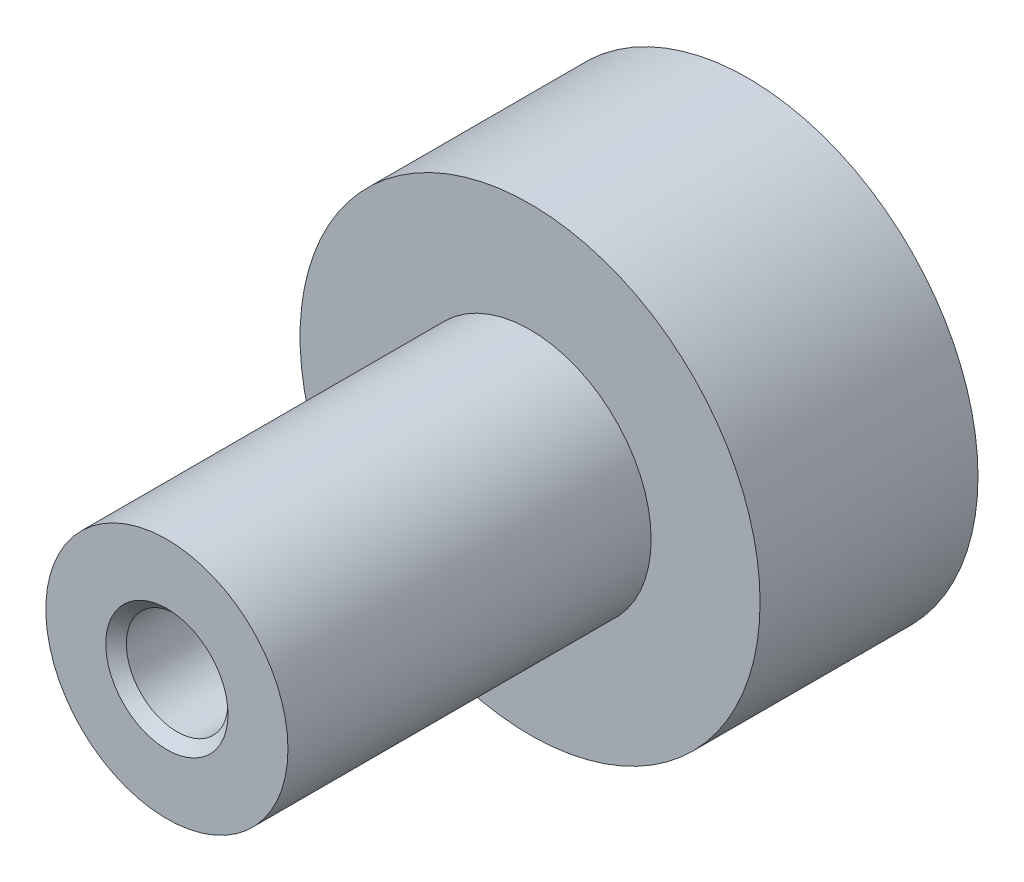
ISO-10303-21;
HEADER;
FILE_DESCRIPTION(('STEP AP214'),'2;1');
FILE_NAME('part.step','',(''),(''),'','','');
FILE_SCHEMA(('AUTOMOTIVE_DESIGN { 1 0 10303 214 1 1 1 1 }'));
ENDSEC;
DATA;
#1=APPLICATION_CONTEXT('core data for automotive mechanical design processes');
#2=APPLICATION_PROTOCOL_DEFINITION('international standard','automotive_design',2000,#1);
#3=PRODUCT_CONTEXT('',#1,'mechanical');
#4=PRODUCT('Part','Part','',(#3));
#5=PRODUCT_RELATED_PRODUCT_CATEGORY('part','',(#4));
#6=PRODUCT_DEFINITION_FORMATION('','',#4);
#7=PRODUCT_DEFINITION_CONTEXT('part definition',#1,'design');
#8=PRODUCT_DEFINITION('design','',#6,#7);
#9=PRODUCT_DEFINITION_SHAPE('','',#8);
#10=(LENGTH_UNIT() NAMED_UNIT(*) SI_UNIT(.MILLI.,.METRE.));
#11=(NAMED_UNIT(*) PLANE_ANGLE_UNIT() SI_UNIT($,.RADIAN.));
#12=(NAMED_UNIT(*) SI_UNIT($,.STERADIAN.) SOLID_ANGLE_UNIT());
#13=UNCERTAINTY_MEASURE_WITH_UNIT(LENGTH_MEASURE(1.E-05),#10,'distance_accuracy_value','');
#14=(GEOMETRIC_REPRESENTATION_CONTEXT(3) GLOBAL_UNCERTAINTY_ASSIGNED_CONTEXT((#13)) GLOBAL_UNIT_ASSIGNED_CONTEXT((#10,
#11,#12)) REPRESENTATION_CONTEXT('',''));
#15=CARTESIAN_POINT('',(0.,0.,0.));
#16=DIRECTION('',(0.,0.,1.));
#17=DIRECTION('',(1.,0.,0.));
#18=AXIS2_PLACEMENT_3D('',#15,#16,#17);
#19=CARTESIAN_POINT('',(0.,0.,6.));
#20=DIRECTION('',(0.,0.,-1.));
#21=DIRECTION('',(-1.,0.,0.));
#22=AXIS2_PLACEMENT_3D('',#19,#20,#21);
#23=CYLINDRICAL_SURFACE('',#22,8.);
#24=DIRECTION('',(0.,0.,-1.));
#25=VECTOR('',#24,1.);
#26=CARTESIAN_POINT('',(-7.46864341197762,2.86694359636239,15.0057826848429));
#27=LINE('',#26,#25);
#28=CARTESIAN_POINT('',(-7.46864341197762,2.86694359636239,6.));
#29=VERTEX_POINT('',#28);
#30=CARTESIAN_POINT('',(-7.46864341197762,2.86694359636239,0.));
#31=VERTEX_POINT('',#30);
#32=EDGE_CURVE('E207',#29,#31,#27,.T.);
#33=ORIENTED_EDGE('',*,*,#32,.T.);
#34=CARTESIAN_POINT('',(0.,0.,0.));
#35=DIRECTION('',(0.,0.,1.));
#36=DIRECTION('',(1.,0.,0.));
#37=AXIS2_PLACEMENT_3D('',#34,#35,#36);
#38=CIRCLE('',#37,8.);
#39=CARTESIAN_POINT('',(-6.7093645435634,4.3571122801202,0.));
#40=VERTEX_POINT('',#39);
#41=EDGE_CURVE('E330',#40,#31,#38,.T.);
#42=ORIENTED_EDGE('',*,*,#41,.F.);
#43=DIRECTION('',(0.,0.,-1.));
#44=VECTOR('',#43,1.);
#45=CARTESIAN_POINT('',(-6.7093645435634,4.3571122801202,14.9487354809935));
#46=LINE('',#45,#44);
#47=CARTESIAN_POINT('',(-6.7093645435634,4.3571122801202,6.));
#48=VERTEX_POINT('',#47);
#49=EDGE_CURVE('E282',#48,#40,#46,.T.);
#50=ORIENTED_EDGE('',*,*,#49,.F.);
#51=CARTESIAN_POINT('',(0.,0.,6.));
#52=DIRECTION('',(0.,0.,1.));
#53=DIRECTION('',(1.,0.,0.));
#54=AXIS2_PLACEMENT_3D('',#51,#52,#53);
#55=CIRCLE('',#54,8.);
#56=EDGE_CURVE('E328',#48,#29,#55,.T.);
#57=ORIENTED_EDGE('',*,*,#56,.T.);
#58=EDGE_LOOP('',(#33,#42,#50,#57));
#59=FACE_BOUND('',#58,.T.);
#60=ADVANCED_FACE('F36',(#59),#23,.F.);
#61=DIRECTION('',(0.,0.,-1.));
#62=VECTOR('',#61,1.);
#63=CARTESIAN_POINT('',(-6.21716769165574,-5.03456312839873,15.0057826848429));
#64=LINE('',#63,#62);
#65=CARTESIAN_POINT('',(-6.21716769165574,-5.03456312839873,6.));
#66=VERTEX_POINT('',#65);
#67=CARTESIAN_POINT('',(-6.21716769165574,-5.03456312839873,0.));
#68=VERTEX_POINT('',#67);
#69=EDGE_CURVE('E216',#66,#68,#64,.T.);
#70=ORIENTED_EDGE('',*,*,#69,.F.);
#71=CARTESIAN_POINT('',(-5.03456312839867,-6.21716769165579,6.));
#72=VERTEX_POINT('',#71);
#73=EDGE_CURVE('E357',#66,#72,#55,.T.);
#74=ORIENTED_EDGE('',*,*,#73,.T.);
#75=DIRECTION('',(0.,0.,-1.));
#76=VECTOR('',#75,1.);
#77=CARTESIAN_POINT('',(-5.03456312839867,-6.21716769165579,15.0057826848429));
#78=LINE('',#77,#76);
#79=CARTESIAN_POINT('',(-5.03456312839867,-6.21716769165579,0.));
#80=VERTEX_POINT('',#79);
#81=EDGE_CURVE('E233',#72,#80,#78,.T.);
#82=ORIENTED_EDGE('',*,*,#81,.T.);
#83=EDGE_CURVE('E336',#68,#80,#38,.T.);
#84=ORIENTED_EDGE('',*,*,#83,.F.);
#85=EDGE_LOOP('',(#70,#74,#82,#84));
#86=FACE_BOUND('',#85,.T.);
#87=ADVANCED_FACE('F355',(#86),#23,.F.);
#88=DIRECTION('',(0.,0.,-1.));
#89=VECTOR('',#88,1.);
#90=CARTESIAN_POINT('',(2.86694359636246,-7.46864341197759,15.0057826848429));
#91=LINE('',#90,#89);
#92=CARTESIAN_POINT('',(2.86694359636246,-7.46864341197759,6.));
#93=VERTEX_POINT('',#92);
#94=CARTESIAN_POINT('',(2.86694359636246,-7.46864341197759,0.));
#95=VERTEX_POINT('',#94);
#96=EDGE_CURVE('E240',#93,#95,#91,.T.);
#97=ORIENTED_EDGE('',*,*,#96,.F.);
#98=CARTESIAN_POINT('',(4.35711228012027,-6.70936454356336,6.));
#99=VERTEX_POINT('',#98);
#100=EDGE_CURVE('E369',#93,#99,#55,.T.);
#101=ORIENTED_EDGE('',*,*,#100,.T.);
#102=DIRECTION('',(0.,0.,-1.));
#103=VECTOR('',#102,1.);
#104=CARTESIAN_POINT('',(4.35711228012027,-6.70936454356336,14.9487354809935));
#105=LINE('',#104,#103);
#106=CARTESIAN_POINT('',(4.35711228012027,-6.70936454356336,0.));
#107=VERTEX_POINT('',#106);
#108=EDGE_CURVE('E251',#99,#107,#105,.T.);
#109=ORIENTED_EDGE('',*,*,#108,.T.);
#110=EDGE_CURVE('E337',#95,#107,#38,.T.);
#111=ORIENTED_EDGE('',*,*,#110,.F.);
#112=EDGE_LOOP('',(#97,#101,#109,#111));
#113=FACE_BOUND('',#112,.T.);
#114=ADVANCED_FACE('F367',(#113),#23,.F.);
#115=DIRECTION('',(0.,0.,-1.));
#116=VECTOR('',#115,1.);
#117=CARTESIAN_POINT('',(0.418687649943556,7.98903627803659,14.9487354809935));
#118=LINE('',#117,#116);
#119=CARTESIAN_POINT('',(0.418687649943556,7.98903627803659,6.));
#120=VERTEX_POINT('',#119);
#121=CARTESIAN_POINT('',(0.418687649943556,7.98903627803659,0.));
#122=VERTEX_POINT('',#121);
#123=EDGE_CURVE('E273',#120,#122,#118,.T.);
#124=ORIENTED_EDGE('',*,*,#123,.T.);
#125=CARTESIAN_POINT('',(2.07055236082017,7.72740661031255,0.));
#126=VERTEX_POINT('',#125);
#127=EDGE_CURVE('E44',#126,#122,#38,.T.);
#128=ORIENTED_EDGE('',*,*,#127,.F.);
#129=DIRECTION('',(0.,0.,-1.));
#130=VECTOR('',#129,1.);
#131=CARTESIAN_POINT('',(2.07055236082017,7.72740661031255,15.0245190528384));
#132=LINE('',#131,#130);
#133=CARTESIAN_POINT('',(2.07055236082017,7.72740661031255,6.));
#134=VERTEX_POINT('',#133);
#135=EDGE_CURVE('E309',#134,#126,#132,.T.);
#136=ORIENTED_EDGE('',*,*,#135,.F.);
#137=EDGE_CURVE('E325',#134,#120,#55,.T.);
#138=ORIENTED_EDGE('',*,*,#137,.T.);
#139=EDGE_LOOP('',(#124,#128,#136,#138));
#140=FACE_BOUND('',#139,.T.);
#141=ADVANCED_FACE('F409',(#140),#23,.F.);
#142=CARTESIAN_POINT('',(0.,0.,0.));
#143=DIRECTION('',(0.,0.,1.));
#144=DIRECTION('',(1.,0.,0.));
#145=AXIS2_PLACEMENT_3D('',#142,#143,#144);
#146=PLANE('',#145);
#147=ORIENTED_EDGE('',*,*,#41,.T.);
#148=DIRECTION('',(0.933580426497202,-0.358367949545298,0.));
#149=VECTOR('',#148,1.);
#150=CARTESIAN_POINT('',(-7.46864341197762,2.86694359636239,0.));
#151=LINE('',#150,#149);
#152=CARTESIAN_POINT('',(-8.16882873185052,3.13571955852136,0.));
#153=VERTEX_POINT('',#152);
#154=EDGE_CURVE('E200',#153,#31,#151,.T.);
#155=ORIENTED_EDGE('',*,*,#154,.F.);
#156=CARTESIAN_POINT('',(1.81921811592645E-13,0.,0.));
#157=DIRECTION('',(0.,0.,-1.));
#158=DIRECTION('',(-0.809016994374951,0.587785252292469,0.));
#159=AXIS2_PLACEMENT_3D('',#156,#157,#158);
#160=CIRCLE('',#159,8.75000000000016);
#161=CARTESIAN_POINT('',(-6.80002716274847,-5.50655342168611,0.));
#162=VERTEX_POINT('',#161);
#163=EDGE_CURVE('E202',#162,#153,#160,.T.);
#164=ORIENTED_EDGE('',*,*,#163,.F.);
#165=DIRECTION('',(-0.777145961456967,-0.629320391049841,0.));
#166=VECTOR('',#165,1.);
#167=CARTESIAN_POINT('',(-6.21716769165574,-5.03456312839873,0.));
#168=LINE('',#167,#166);
#169=EDGE_CURVE('E196',#68,#162,#168,.T.);
#170=ORIENTED_EDGE('',*,*,#169,.F.);
#171=ORIENTED_EDGE('',*,*,#83,.T.);
#172=DIRECTION('',(0.629320391049833,0.777145961456974,0.));
#173=VECTOR('',#172,1.);
#174=CARTESIAN_POINT('',(-5.03456312839867,-6.21716769165579,0.));
#175=LINE('',#174,#173);
#176=CARTESIAN_POINT('',(-5.50655342168604,-6.80002716274853,0.));
#177=VERTEX_POINT('',#176);
#178=EDGE_CURVE('E226',#177,#80,#175,.T.);
#179=ORIENTED_EDGE('',*,*,#178,.F.);
#180=CARTESIAN_POINT('',(0.,1.81538035696024E-13,0.));
#181=DIRECTION('',(0.,0.,-1.));
#182=DIRECTION('',(-0.809016994374942,-0.58778525229248,0.));
#183=AXIS2_PLACEMENT_3D('',#180,#181,#182);
#184=CIRCLE('',#183,8.75000000000016);
#185=CARTESIAN_POINT('',(3.13571955852144,-8.16882873185049,0.));
#186=VERTEX_POINT('',#185);
#187=EDGE_CURVE('E228',#186,#177,#184,.T.);
#188=ORIENTED_EDGE('',*,*,#187,.F.);
#189=DIRECTION('',(0.358367949545308,-0.933580426497199,0.));
#190=VECTOR('',#189,1.);
#191=CARTESIAN_POINT('',(2.86694359636246,-7.46864341197759,0.));
#192=LINE('',#191,#190);
#193=EDGE_CURVE('E223',#95,#186,#192,.T.);
#194=ORIENTED_EDGE('',*,*,#193,.F.);
#195=ORIENTED_EDGE('',*,*,#110,.T.);
#196=DIRECTION('',(-0.544639035015034,0.83867056794542,0.));
#197=VECTOR('',#196,1.);
#198=CARTESIAN_POINT('',(4.35711228012027,-6.70936454356336,0.));
#199=LINE('',#198,#197);
#200=CARTESIAN_POINT('',(4.76559155638155,-7.33836746952242,0.));
#201=VERTEX_POINT('',#200);
#202=EDGE_CURVE('E189',#201,#107,#199,.T.);
#203=ORIENTED_EDGE('',*,*,#202,.F.);
#204=CARTESIAN_POINT('',(-1.63384052015606E-13,0.,0.));
#205=DIRECTION('',(0.,0.,-1.));
#206=DIRECTION('',(0.309016994374958,-0.95105651629515,0.));
#207=AXIS2_PLACEMENT_3D('',#204,#205,#206);
#208=CIRCLE('',#207,8.75000000000016);
#209=CARTESIAN_POINT('',(8.73800842910252,0.457939617125851,0.));
#210=VERTEX_POINT('',#209);
#211=EDGE_CURVE('E185',#210,#201,#208,.T.);
#212=ORIENTED_EDGE('',*,*,#211,.F.);
#213=DIRECTION('',(0.998629534754573,0.0523359562429548,0.));
#214=VECTOR('',#213,1.);
#215=CARTESIAN_POINT('',(7.98903627803659,0.418687649943635,0.));
#216=LINE('',#215,#214);
#217=CARTESIAN_POINT('',(7.98903627803659,0.418687649943635,0.));
#218=VERTEX_POINT('',#217);
#219=EDGE_CURVE('E246',#218,#210,#216,.T.);
#220=ORIENTED_EDGE('',*,*,#219,.F.);
#221=CARTESIAN_POINT('',(7.72740661031255,2.07055236082014,0.));
#222=VERTEX_POINT('',#221);
#223=EDGE_CURVE('E327',#218,#222,#38,.T.);
#224=ORIENTED_EDGE('',*,*,#223,.T.);
#225=DIRECTION('',(-0.965925826289069,-0.258819045102517,0.));
#226=VECTOR('',#225,1.);
#227=CARTESIAN_POINT('',(7.72740661031255,2.07055236082014,0.));
#228=LINE('',#227,#226);
#229=CARTESIAN_POINT('',(8.45185098002936,2.26466664464703,0.));
#230=VERTEX_POINT('',#229);
#231=EDGE_CURVE('E293',#230,#222,#228,.T.);
#232=ORIENTED_EDGE('',*,*,#231,.F.);
#233=CARTESIAN_POINT('',(-1.30971622436249E-13,-1.29236898960272E-13,0.));
#234=DIRECTION('',(0.,0.,-1.));
#235=DIRECTION('',(1.,0.,0.));
#236=AXIS2_PLACEMENT_3D('',#233,#234,#235);
#237=CIRCLE('',#236,8.75000000000016);
#238=CARTESIAN_POINT('',(2.26466664464706,8.45185098002935,0.));
#239=VERTEX_POINT('',#238);
#240=EDGE_CURVE('E288',#239,#230,#237,.T.);
#241=ORIENTED_EDGE('',*,*,#240,.F.);
#242=DIRECTION('',(0.258819045102521,0.965925826289068,0.));
#243=VECTOR('',#242,1.);
#244=CARTESIAN_POINT('',(2.07055236082017,7.72740661031255,0.));
#245=LINE('',#244,#243);
#246=EDGE_CURVE('E289',#126,#239,#245,.T.);
#247=ORIENTED_EDGE('',*,*,#246,.F.);
#248=ORIENTED_EDGE('',*,*,#127,.T.);
#249=DIRECTION('',(-0.0523359562429445,-0.998629534754574,0.));
#250=VECTOR('',#249,1.);
#251=CARTESIAN_POINT('',(0.418687649943556,7.98903627803659,0.));
#252=LINE('',#251,#250);
#253=CARTESIAN_POINT('',(0.457939617125764,8.73800842910252,0.));
#254=VERTEX_POINT('',#253);
#255=EDGE_CURVE('E268',#254,#122,#252,.T.);
#256=ORIENTED_EDGE('',*,*,#255,.F.);
#257=CARTESIAN_POINT('',(0.,-1.64497813046785E-13,0.));
#258=DIRECTION('',(0.,0.,-1.));
#259=DIRECTION('',(0.309016994374945,0.951056516295155,0.));
#260=AXIS2_PLACEMENT_3D('',#257,#258,#259);
#261=CIRCLE('',#260,8.75000000000016);
#262=CARTESIAN_POINT('',(-7.33836746952247,4.76559155638147,0.));
#263=VERTEX_POINT('',#262);
#264=EDGE_CURVE('E222',#263,#254,#261,.T.);
#265=ORIENTED_EDGE('',*,*,#264,.F.);
#266=DIRECTION('',(-0.838670567945425,0.544639035015025,0.));
#267=VECTOR('',#266,1.);
#268=CARTESIAN_POINT('',(-6.7093645435634,4.3571122801202,0.));
#269=LINE('',#268,#267);
#270=EDGE_CURVE('E264',#40,#263,#269,.T.);
#271=ORIENTED_EDGE('',*,*,#270,.F.);
#272=EDGE_LOOP('',(#147,#155,#164,#170,#171,#179,#188,#194,#195,#203,#212,#220,#224,#232,#241,
#247,#248,#256,#265,#271));
#273=FACE_BOUND('',#272,.T.);
#274=CARTESIAN_POINT('',(0.,0.,0.));
#275=DIRECTION('',(0.,0.,1.));
#276=DIRECTION('',(1.,0.,0.));
#277=AXIS2_PLACEMENT_3D('',#274,#275,#276);
#278=CIRCLE('',#277,9.5);
#279=CARTESIAN_POINT('',(9.5,0.,0.));
#280=VERTEX_POINT('',#279);
#281=EDGE_CURVE('E11',#280,#280,#278,.T.);
#282=ORIENTED_EDGE('',*,*,#281,.F.);
#283=EDGE_LOOP('',(#282));
#284=FACE_BOUND('',#283,.T.);
#285=ADVANCED_FACE('F349',(#273,#284),#146,.F.);
#286=CARTESIAN_POINT('',(0.,0.,6.));
#287=DIRECTION('',(0.,0.,-1.));
#288=DIRECTION('',(-1.,0.,0.));
#289=AXIS2_PLACEMENT_3D('',#286,#287,#288);
#290=CYLINDRICAL_SURFACE('',#289,9.5);
#291=ORIENTED_EDGE('',*,*,#281,.T.);
#292=EDGE_LOOP('',(#291));
#293=FACE_BOUND('',#292,.T.);
#294=CARTESIAN_POINT('',(0.,0.,9.));
#295=DIRECTION('',(0.,0.,1.));
#296=DIRECTION('',(1.,0.,0.));
#297=AXIS2_PLACEMENT_3D('',#294,#295,#296);
#298=CIRCLE('',#297,9.5);
#299=CARTESIAN_POINT('',(9.5,0.,9.));
#300=VERTEX_POINT('',#299);
#301=EDGE_CURVE('E319',#300,#300,#298,.T.);
#302=ORIENTED_EDGE('',*,*,#301,.F.);
#303=EDGE_LOOP('',(#302));
#304=FACE_BOUND('',#303,.T.);
#305=ADVANCED_FACE('F38',(#293,#304),#290,.T.);
#306=DIRECTION('',(0.,0.,-1.));
#307=VECTOR('',#306,1.);
#308=CARTESIAN_POINT('',(7.98903627803659,0.418687649943635,14.9487354809935));
#309=LINE('',#308,#307);
#310=CARTESIAN_POINT('',(7.98903627803659,0.418687649943634,6.));
#311=VERTEX_POINT('',#310);
#312=EDGE_CURVE('E258',#311,#218,#309,.T.);
#313=ORIENTED_EDGE('',*,*,#312,.F.);
#314=CARTESIAN_POINT('',(7.72740661031255,2.07055236082014,6.));
#315=VERTEX_POINT('',#314);
#316=EDGE_CURVE('E324',#311,#315,#55,.T.);
#317=ORIENTED_EDGE('',*,*,#316,.T.);
#318=DIRECTION('',(0.,0.,-1.));
#319=VECTOR('',#318,1.);
#320=CARTESIAN_POINT('',(7.72740661031255,2.07055236082014,15.0245190528384));
#321=LINE('',#320,#319);
#322=EDGE_CURVE('E300',#315,#222,#321,.T.);
#323=ORIENTED_EDGE('',*,*,#322,.T.);
#324=ORIENTED_EDGE('',*,*,#223,.F.);
#325=EDGE_LOOP('',(#313,#317,#323,#324));
#326=FACE_BOUND('',#325,.T.);
#327=ADVANCED_FACE('F382',(#326),#23,.F.);
#328=CARTESIAN_POINT('',(0.,0.,6.));
#329=DIRECTION('',(0.,0.,1.));
#330=DIRECTION('',(1.,0.,0.));
#331=AXIS2_PLACEMENT_3D('',#328,#329,#330);
#332=PLANE('',#331);
#333=ORIENTED_EDGE('',*,*,#137,.F.);
#334=DIRECTION('',(0.258819045102521,0.965925826289068,0.));
#335=VECTOR('',#334,1.);
#336=CARTESIAN_POINT('',(2.07055236082017,7.72740661031255,6.));
#337=LINE('',#336,#335);
#338=CARTESIAN_POINT('',(2.26466664464706,8.45185098002935,6.));
#339=VERTEX_POINT('',#338);
#340=EDGE_CURVE('E306',#134,#339,#337,.T.);
#341=ORIENTED_EDGE('',*,*,#340,.T.);
#342=CARTESIAN_POINT('',(-1.30971622436249E-13,-1.29236898960272E-13,6.));
#343=DIRECTION('',(0.,0.,1.));
#344=DIRECTION('',(1.,0.,0.));
#345=AXIS2_PLACEMENT_3D('',#342,#343,#344);
#346=CIRCLE('',#345,8.75000000000016);
#347=CARTESIAN_POINT('',(8.45185098002936,2.26466664464703,6.));
#348=VERTEX_POINT('',#347);
#349=EDGE_CURVE('E301',#339,#348,#346,.F.);
#350=ORIENTED_EDGE('',*,*,#349,.T.);
#351=DIRECTION('',(-0.965925826289069,-0.258819045102517,0.));
#352=VECTOR('',#351,1.);
#353=CARTESIAN_POINT('',(7.72740661031255,2.07055236082014,6.));
#354=LINE('',#353,#352);
#355=EDGE_CURVE('E292',#348,#315,#354,.T.);
#356=ORIENTED_EDGE('',*,*,#355,.T.);
#357=ORIENTED_EDGE('',*,*,#316,.F.);
#358=DIRECTION('',(0.998629534754574,0.0523359562429548,0.));
#359=VECTOR('',#358,1.);
#360=CARTESIAN_POINT('',(7.98903627803659,0.418687649943635,6.));
#361=LINE('',#360,#359);
#362=CARTESIAN_POINT('',(8.73800842910252,0.457939617125851,6.));
#363=VERTEX_POINT('',#362);
#364=EDGE_CURVE('E255',#311,#363,#361,.T.);
#365=ORIENTED_EDGE('',*,*,#364,.T.);
#366=CARTESIAN_POINT('',(-1.63384052015606E-13,0.,6.));
#367=DIRECTION('',(0.,0.,1.));
#368=DIRECTION('',(1.,0.,0.));
#369=AXIS2_PLACEMENT_3D('',#366,#367,#368);
#370=CIRCLE('',#369,8.75000000000016);
#371=CARTESIAN_POINT('',(4.76559155638154,-7.33836746952242,6.));
#372=VERTEX_POINT('',#371);
#373=EDGE_CURVE('E252',#363,#372,#370,.F.);
#374=ORIENTED_EDGE('',*,*,#373,.T.);
#375=DIRECTION('',(-0.544639035015034,0.83867056794542,0.));
#376=VECTOR('',#375,1.);
#377=CARTESIAN_POINT('',(4.35711228012027,-6.70936454356336,6.));
#378=LINE('',#377,#376);
#379=EDGE_CURVE('E51',#372,#99,#378,.T.);
#380=ORIENTED_EDGE('',*,*,#379,.T.);
#381=ORIENTED_EDGE('',*,*,#100,.F.);
#382=DIRECTION('',(0.358367949545308,-0.933580426497199,0.));
#383=VECTOR('',#382,1.);
#384=CARTESIAN_POINT('',(2.86694359636246,-7.46864341197759,6.));
#385=LINE('',#384,#383);
#386=CARTESIAN_POINT('',(3.13571955852144,-8.16882873185049,6.));
#387=VERTEX_POINT('',#386);
#388=EDGE_CURVE('E237',#93,#387,#385,.T.);
#389=ORIENTED_EDGE('',*,*,#388,.T.);
#390=CARTESIAN_POINT('',(0.,1.81538035696024E-13,6.));
#391=DIRECTION('',(0.,0.,1.));
#392=DIRECTION('',(1.,0.,0.));
#393=AXIS2_PLACEMENT_3D('',#390,#391,#392);
#394=CIRCLE('',#393,8.75000000000016);
#395=CARTESIAN_POINT('',(-5.50655342168604,-6.80002716274853,6.));
#396=VERTEX_POINT('',#395);
#397=EDGE_CURVE('E234',#387,#396,#394,.F.);
#398=ORIENTED_EDGE('',*,*,#397,.T.);
#399=DIRECTION('',(0.629320391049833,0.777145961456974,0.));
#400=VECTOR('',#399,1.);
#401=CARTESIAN_POINT('',(-5.03456312839867,-6.21716769165579,6.));
#402=LINE('',#401,#400);
#403=EDGE_CURVE('E58',#396,#72,#402,.T.);
#404=ORIENTED_EDGE('',*,*,#403,.T.);
#405=ORIENTED_EDGE('',*,*,#73,.F.);
#406=DIRECTION('',(-0.777145961456968,-0.629320391049842,0.));
#407=VECTOR('',#406,1.);
#408=CARTESIAN_POINT('',(-6.21716769165574,-5.03456312839873,6.));
#409=LINE('',#408,#407);
#410=CARTESIAN_POINT('',(-6.80002716274847,-5.50655342168611,6.));
#411=VERTEX_POINT('',#410);
#412=EDGE_CURVE('E213',#66,#411,#409,.T.);
#413=ORIENTED_EDGE('',*,*,#412,.T.);
#414=CARTESIAN_POINT('',(1.81921811592645E-13,0.,6.));
#415=DIRECTION('',(0.,0.,1.));
#416=DIRECTION('',(1.,0.,0.));
#417=AXIS2_PLACEMENT_3D('',#414,#415,#416);
#418=CIRCLE('',#417,8.75000000000016);
#419=CARTESIAN_POINT('',(-8.16882873185052,3.13571955852136,6.));
#420=VERTEX_POINT('',#419);
#421=EDGE_CURVE('E208',#411,#420,#418,.F.);
#422=ORIENTED_EDGE('',*,*,#421,.T.);
#423=DIRECTION('',(0.933580426497203,-0.358367949545298,0.));
#424=VECTOR('',#423,1.);
#425=CARTESIAN_POINT('',(-7.46864341197762,2.86694359636239,6.));
#426=LINE('',#425,#424);
#427=EDGE_CURVE('E199',#420,#29,#426,.T.);
#428=ORIENTED_EDGE('',*,*,#427,.T.);
#429=ORIENTED_EDGE('',*,*,#56,.F.);
#430=DIRECTION('',(-0.838670567945425,0.544639035015025,0.));
#431=VECTOR('',#430,1.);
#432=CARTESIAN_POINT('',(-6.7093645435634,4.3571122801202,6.));
#433=LINE('',#432,#431);
#434=CARTESIAN_POINT('',(-7.33836746952247,4.76559155638147,6.));
#435=VERTEX_POINT('',#434);
#436=EDGE_CURVE('E279',#48,#435,#433,.T.);
#437=ORIENTED_EDGE('',*,*,#436,.T.);
#438=CARTESIAN_POINT('',(0.,-1.64497813046785E-13,6.));
#439=DIRECTION('',(0.,0.,1.));
#440=DIRECTION('',(1.,0.,0.));
#441=AXIS2_PLACEMENT_3D('',#438,#439,#440);
#442=CIRCLE('',#441,8.75000000000016);
#443=CARTESIAN_POINT('',(0.457939617125764,8.73800842910252,6.));
#444=VERTEX_POINT('',#443);
#445=EDGE_CURVE('E274',#435,#444,#442,.F.);
#446=ORIENTED_EDGE('',*,*,#445,.T.);
#447=DIRECTION('',(-0.0523359562429445,-0.998629534754574,0.));
#448=VECTOR('',#447,1.);
#449=CARTESIAN_POINT('',(0.418687649943556,7.98903627803659,6.));
#450=LINE('',#449,#448);
#451=EDGE_CURVE('E267',#444,#120,#450,.T.);
#452=ORIENTED_EDGE('',*,*,#451,.T.);
#453=EDGE_LOOP('',(#333,#341,#350,#356,#357,#365,#374,#380,#381,#389,#398,#404,#405,#413,#422,
#428,#429,#437,#446,#452));
#454=FACE_BOUND('',#453,.T.);
#455=ADVANCED_FACE('F384',(#454),#332,.F.);
#456=CARTESIAN_POINT('',(0.,0.,9.));
#457=DIRECTION('',(0.,0.,1.));
#458=DIRECTION('',(1.,0.,0.));
#459=AXIS2_PLACEMENT_3D('',#456,#457,#458);
#460=PLANE('',#459);
#461=CARTESIAN_POINT('',(0.,0.,9.));
#462=DIRECTION('',(0.,0.,1.));
#463=DIRECTION('',(1.,0.,0.));
#464=AXIS2_PLACEMENT_3D('',#461,#462,#463);
#465=CIRCLE('',#464,5.);
#466=CARTESIAN_POINT('',(5.,0.,9.));
#467=VERTEX_POINT('',#466);
#468=EDGE_CURVE('E315',#467,#467,#465,.T.);
#469=ORIENTED_EDGE('',*,*,#468,.F.);
#470=EDGE_LOOP('',(#469));
#471=FACE_BOUND('',#470,.T.);
#472=ORIENTED_EDGE('',*,*,#301,.T.);
#473=EDGE_LOOP('',(#472));
#474=FACE_BOUND('',#473,.T.);
#475=ADVANCED_FACE('F441',(#471,#474),#460,.T.);
#476=CARTESIAN_POINT('',(0.,0.,24.));
#477=DIRECTION('',(0.,0.,-1.));
#478=DIRECTION('',(-1.,0.,0.));
#479=AXIS2_PLACEMENT_3D('',#476,#477,#478);
#480=CYLINDRICAL_SURFACE('',#479,5.);
#481=CARTESIAN_POINT('',(0.,0.,24.));
#482=DIRECTION('',(0.,0.,1.));
#483=DIRECTION('',(1.,0.,0.));
#484=AXIS2_PLACEMENT_3D('',#481,#482,#483);
#485=CIRCLE('',#484,5.);
#486=CARTESIAN_POINT('',(5.,0.,24.));
#487=VERTEX_POINT('',#486);
#488=EDGE_CURVE('E316',#487,#487,#485,.T.);
#489=ORIENTED_EDGE('',*,*,#488,.F.);
#490=EDGE_LOOP('',(#489));
#491=FACE_BOUND('',#490,.T.);
#492=ORIENTED_EDGE('',*,*,#468,.T.);
#493=EDGE_LOOP('',(#492));
#494=FACE_BOUND('',#493,.T.);
#495=ADVANCED_FACE('F427',(#491,#494),#480,.T.);
#496=CARTESIAN_POINT('',(0.,0.,24.));
#497=DIRECTION('',(0.,0.,1.));
#498=DIRECTION('',(1.,0.,0.));
#499=AXIS2_PLACEMENT_3D('',#496,#497,#498);
#500=PLANE('',#499);
#501=CARTESIAN_POINT('',(0.,0.,24.));
#502=DIRECTION('',(0.,0.,1.));
#503=DIRECTION('',(1.,0.,0.));
#504=AXIS2_PLACEMENT_3D('',#501,#502,#503);
#505=CIRCLE('',#504,2.525);
#506=CARTESIAN_POINT('',(2.525,0.,24.));
#507=VERTEX_POINT('',#506);
#508=EDGE_CURVE('E192',#507,#507,#505,.T.);
#509=ORIENTED_EDGE('',*,*,#508,.F.);
#510=EDGE_LOOP('',(#509));
#511=FACE_BOUND('',#510,.T.);
#512=ORIENTED_EDGE('',*,*,#488,.T.);
#513=EDGE_LOOP('',(#512));
#514=FACE_BOUND('',#513,.T.);
#515=ADVANCED_FACE('F420',(#511,#514),#500,.T.);
#516=CARTESIAN_POINT('',(7.72740661031255,2.07055236082014,15.0245190528384));
#517=DIRECTION('',(0.258819045102517,-0.965925826289069,0.));
#518=DIRECTION('',(0.965925826289069,0.258819045102517,0.));
#519=AXIS2_PLACEMENT_3D('',#516,#517,#518);
#520=PLANE('',#519);
#521=DIRECTION('',(0.,0.,-1.));
#522=VECTOR('',#521,1.);
#523=CARTESIAN_POINT('',(8.45185098002936,2.26466664464703,15.0245190528384));
#524=LINE('',#523,#522);
#525=EDGE_CURVE('E304',#348,#230,#524,.T.);
#526=ORIENTED_EDGE('',*,*,#525,.T.);
#527=ORIENTED_EDGE('',*,*,#231,.T.);
#528=ORIENTED_EDGE('',*,*,#322,.F.);
#529=ORIENTED_EDGE('',*,*,#355,.F.);
#530=EDGE_LOOP('',(#526,#527,#528,#529));
#531=FACE_BOUND('',#530,.T.);
#532=ADVANCED_FACE('F418',(#531),#520,.F.);
#533=CARTESIAN_POINT('',(2.07055236082017,7.72740661031255,15.0245190528384));
#534=DIRECTION('',(-0.965925826289068,0.258819045102521,0.));
#535=DIRECTION('',(-0.258819045102521,-0.965925826289068,0.));
#536=AXIS2_PLACEMENT_3D('',#533,#534,#535);
#537=PLANE('',#536);
#538=ORIENTED_EDGE('',*,*,#135,.T.);
#539=ORIENTED_EDGE('',*,*,#246,.T.);
#540=DIRECTION('',(0.,0.,-1.));
#541=VECTOR('',#540,1.);
#542=CARTESIAN_POINT('',(2.26466664464706,8.45185098002935,15.0245190528384));
#543=LINE('',#542,#541);
#544=EDGE_CURVE('E305',#339,#239,#543,.T.);
#545=ORIENTED_EDGE('',*,*,#544,.F.);
#546=ORIENTED_EDGE('',*,*,#340,.F.);
#547=EDGE_LOOP('',(#538,#539,#545,#546));
#548=FACE_BOUND('',#547,.T.);
#549=ADVANCED_FACE('F411',(#548),#537,.F.);
#550=CARTESIAN_POINT('',(-1.30971622436249E-13,-1.29236898960272E-13,15.0245190528384));
#551=DIRECTION('',(0.,0.,-1.));
#552=DIRECTION('',(-1.,0.,0.));
#553=AXIS2_PLACEMENT_3D('',#550,#551,#552);
#554=CYLINDRICAL_SURFACE('',#553,8.75000000000016);
#555=ORIENTED_EDGE('',*,*,#544,.T.);
#556=ORIENTED_EDGE('',*,*,#240,.T.);
#557=ORIENTED_EDGE('',*,*,#525,.F.);
#558=ORIENTED_EDGE('',*,*,#349,.F.);
#559=EDGE_LOOP('',(#555,#556,#557,#558));
#560=FACE_BOUND('',#559,.T.);
#561=ADVANCED_FACE('F416',(#560),#554,.F.);
#562=CARTESIAN_POINT('',(0.418687649943556,7.98903627803659,14.9487354809935));
#563=DIRECTION('',(0.998629534754574,-0.0523359562429445,0.));
#564=DIRECTION('',(0.0523359562429445,0.998629534754574,0.));
#565=AXIS2_PLACEMENT_3D('',#562,#563,#564);
#566=PLANE('',#565);
#567=DIRECTION('',(0.,0.,-1.));
#568=VECTOR('',#567,1.);
#569=CARTESIAN_POINT('',(0.457939617125764,8.73800842910252,14.9487354809935));
#570=LINE('',#569,#568);
#571=EDGE_CURVE('E277',#444,#254,#570,.T.);
#572=ORIENTED_EDGE('',*,*,#571,.T.);
#573=ORIENTED_EDGE('',*,*,#255,.T.);
#574=ORIENTED_EDGE('',*,*,#123,.F.);
#575=ORIENTED_EDGE('',*,*,#451,.F.);
#576=EDGE_LOOP('',(#572,#573,#574,#575));
#577=FACE_BOUND('',#576,.T.);
#578=ADVANCED_FACE('F406',(#577),#566,.F.);
#579=CARTESIAN_POINT('',(-6.7093645435634,4.3571122801202,14.9487354809935));
#580=DIRECTION('',(-0.544639035015025,-0.838670567945425,0.));
#581=DIRECTION('',(0.838670567945425,-0.544639035015025,0.));
#582=AXIS2_PLACEMENT_3D('',#579,#580,#581);
#583=PLANE('',#582);
#584=ORIENTED_EDGE('',*,*,#49,.T.);
#585=ORIENTED_EDGE('',*,*,#270,.T.);
#586=DIRECTION('',(0.,0.,-1.));
#587=VECTOR('',#586,1.);
#588=CARTESIAN_POINT('',(-7.33836746952247,4.76559155638147,14.9487354809935));
#589=LINE('',#588,#587);
#590=EDGE_CURVE('E278',#435,#263,#589,.T.);
#591=ORIENTED_EDGE('',*,*,#590,.F.);
#592=ORIENTED_EDGE('',*,*,#436,.F.);
#593=EDGE_LOOP('',(#584,#585,#591,#592));
#594=FACE_BOUND('',#593,.T.);
#595=ADVANCED_FACE('F400',(#594),#583,.F.);
#596=CARTESIAN_POINT('',(0.,-1.64497813046785E-13,14.9487354809935));
#597=DIRECTION('',(0.,0.,-1.));
#598=DIRECTION('',(-1.,0.,0.));
#599=AXIS2_PLACEMENT_3D('',#596,#597,#598);
#600=CYLINDRICAL_SURFACE('',#599,8.75000000000016);
#601=ORIENTED_EDGE('',*,*,#590,.T.);
#602=ORIENTED_EDGE('',*,*,#264,.T.);
#603=ORIENTED_EDGE('',*,*,#571,.F.);
#604=ORIENTED_EDGE('',*,*,#445,.F.);
#605=EDGE_LOOP('',(#601,#602,#603,#604));
#606=FACE_BOUND('',#605,.T.);
#607=ADVANCED_FACE('F402',(#606),#600,.F.);
#608=CARTESIAN_POINT('',(4.35711228012027,-6.70936454356336,14.9487354809935));
#609=DIRECTION('',(-0.83867056794542,-0.544639035015034,0.));
#610=DIRECTION('',(0.544639035015034,-0.83867056794542,0.));
#611=AXIS2_PLACEMENT_3D('',#608,#609,#610);
#612=PLANE('',#611);
#613=DIRECTION('',(0.,0.,-1.));
#614=VECTOR('',#613,1.);
#615=CARTESIAN_POINT('',(4.76559155638155,-7.33836746952242,14.9487354809935));
#616=LINE('',#615,#614);
#617=EDGE_CURVE('E231',#372,#201,#616,.T.);
#618=ORIENTED_EDGE('',*,*,#617,.T.);
#619=ORIENTED_EDGE('',*,*,#202,.T.);
#620=ORIENTED_EDGE('',*,*,#108,.F.);
#621=ORIENTED_EDGE('',*,*,#379,.F.);
#622=EDGE_LOOP('',(#618,#619,#620,#621));
#623=FACE_BOUND('',#622,.T.);
#624=ADVANCED_FACE('F371',(#623),#612,.F.);
#625=CARTESIAN_POINT('',(7.98903627803659,0.418687649943635,14.9487354809935));
#626=DIRECTION('',(-0.0523359562429548,0.998629534754573,0.));
#627=DIRECTION('',(-0.998629534754574,-0.0523359562429548,0.));
#628=AXIS2_PLACEMENT_3D('',#625,#626,#627);
#629=PLANE('',#628);
#630=ORIENTED_EDGE('',*,*,#312,.T.);
#631=ORIENTED_EDGE('',*,*,#219,.T.);
#632=DIRECTION('',(0.,0.,-1.));
#633=VECTOR('',#632,1.);
#634=CARTESIAN_POINT('',(8.73800842910252,0.457939617125851,14.9487354809935));
#635=LINE('',#634,#633);
#636=EDGE_CURVE('E254',#363,#210,#635,.T.);
#637=ORIENTED_EDGE('',*,*,#636,.F.);
#638=ORIENTED_EDGE('',*,*,#364,.F.);
#639=EDGE_LOOP('',(#630,#631,#637,#638));
#640=FACE_BOUND('',#639,.T.);
#641=ADVANCED_FACE('F378',(#640),#629,.F.);
#642=CARTESIAN_POINT('',(-1.63384052015606E-13,0.,14.9487354809935));
#643=DIRECTION('',(0.,0.,-1.));
#644=DIRECTION('',(-1.,0.,0.));
#645=AXIS2_PLACEMENT_3D('',#642,#643,#644);
#646=CYLINDRICAL_SURFACE('',#645,8.75000000000016);
#647=ORIENTED_EDGE('',*,*,#636,.T.);
#648=ORIENTED_EDGE('',*,*,#211,.T.);
#649=ORIENTED_EDGE('',*,*,#617,.F.);
#650=ORIENTED_EDGE('',*,*,#373,.F.);
#651=EDGE_LOOP('',(#647,#648,#649,#650));
#652=FACE_BOUND('',#651,.T.);
#653=ADVANCED_FACE('F375',(#652),#646,.F.);
#654=CARTESIAN_POINT('',(-5.03456312839867,-6.21716769165579,15.0057826848429));
#655=DIRECTION('',(-0.777145961456974,0.629320391049833,0.));
#656=DIRECTION('',(-0.629320391049833,-0.777145961456974,0.));
#657=AXIS2_PLACEMENT_3D('',#654,#655,#656);
#658=PLANE('',#657);
#659=DIRECTION('',(0.,0.,-1.));
#660=VECTOR('',#659,1.);
#661=CARTESIAN_POINT('',(-5.50655342168604,-6.80002716274853,15.0057826848429));
#662=LINE('',#661,#660);
#663=EDGE_CURVE('E205',#396,#177,#662,.T.);
#664=ORIENTED_EDGE('',*,*,#663,.T.);
#665=ORIENTED_EDGE('',*,*,#178,.T.);
#666=ORIENTED_EDGE('',*,*,#81,.F.);
#667=ORIENTED_EDGE('',*,*,#403,.F.);
#668=EDGE_LOOP('',(#664,#665,#666,#667));
#669=FACE_BOUND('',#668,.T.);
#670=ADVANCED_FACE('F359',(#669),#658,.F.);
#671=CARTESIAN_POINT('',(2.86694359636246,-7.46864341197759,15.0057826848429));
#672=DIRECTION('',(0.933580426497199,0.358367949545308,0.));
#673=DIRECTION('',(-0.358367949545308,0.933580426497199,0.));
#674=AXIS2_PLACEMENT_3D('',#671,#672,#673);
#675=PLANE('',#674);
#676=ORIENTED_EDGE('',*,*,#96,.T.);
#677=ORIENTED_EDGE('',*,*,#193,.T.);
#678=DIRECTION('',(0.,0.,-1.));
#679=VECTOR('',#678,1.);
#680=CARTESIAN_POINT('',(3.13571955852144,-8.16882873185049,15.0057826848429));
#681=LINE('',#680,#679);
#682=EDGE_CURVE('E236',#387,#186,#681,.T.);
#683=ORIENTED_EDGE('',*,*,#682,.F.);
#684=ORIENTED_EDGE('',*,*,#388,.F.);
#685=EDGE_LOOP('',(#676,#677,#683,#684));
#686=FACE_BOUND('',#685,.T.);
#687=ADVANCED_FACE('F579',(#686),#675,.F.);
#688=CARTESIAN_POINT('',(0.,1.81538035696024E-13,15.0057826848429));
#689=DIRECTION('',(0.,0.,-1.));
#690=DIRECTION('',(-1.,0.,0.));
#691=AXIS2_PLACEMENT_3D('',#688,#689,#690);
#692=CYLINDRICAL_SURFACE('',#691,8.75000000000016);
#693=ORIENTED_EDGE('',*,*,#682,.T.);
#694=ORIENTED_EDGE('',*,*,#187,.T.);
#695=ORIENTED_EDGE('',*,*,#663,.F.);
#696=ORIENTED_EDGE('',*,*,#397,.F.);
#697=EDGE_LOOP('',(#693,#694,#695,#696));
#698=FACE_BOUND('',#697,.T.);
#699=ADVANCED_FACE('F362',(#698),#692,.F.);
#700=CARTESIAN_POINT('',(-7.46864341197762,2.86694359636239,15.0057826848429));
#701=DIRECTION('',(0.358367949545298,0.933580426497203,0.));
#702=DIRECTION('',(-0.933580426497203,0.358367949545298,0.));
#703=AXIS2_PLACEMENT_3D('',#700,#701,#702);
#704=PLANE('',#703);
#705=DIRECTION('',(0.,0.,-1.));
#706=VECTOR('',#705,1.);
#707=CARTESIAN_POINT('',(-8.16882873185052,3.13571955852136,15.0057826848429));
#708=LINE('',#707,#706);
#709=EDGE_CURVE('E211',#420,#153,#708,.T.);
#710=ORIENTED_EDGE('',*,*,#709,.T.);
#711=ORIENTED_EDGE('',*,*,#154,.T.);
#712=ORIENTED_EDGE('',*,*,#32,.F.);
#713=ORIENTED_EDGE('',*,*,#427,.F.);
#714=EDGE_LOOP('',(#710,#711,#712,#713));
#715=FACE_BOUND('',#714,.T.);
#716=ADVANCED_FACE('F394',(#715),#704,.F.);
#717=CARTESIAN_POINT('',(-6.21716769165574,-5.03456312839873,15.0057826848429));
#718=DIRECTION('',(0.629320391049841,-0.777145961456967,0.));
#719=DIRECTION('',(0.777145961456968,0.629320391049842,0.));
#720=AXIS2_PLACEMENT_3D('',#717,#718,#719);
#721=PLANE('',#720);
#722=ORIENTED_EDGE('',*,*,#69,.T.);
#723=ORIENTED_EDGE('',*,*,#169,.T.);
#724=DIRECTION('',(0.,0.,-1.));
#725=VECTOR('',#724,1.);
#726=CARTESIAN_POINT('',(-6.80002716274847,-5.50655342168611,15.0057826848429));
#727=LINE('',#726,#725);
#728=EDGE_CURVE('E212',#411,#162,#727,.T.);
#729=ORIENTED_EDGE('',*,*,#728,.F.);
#730=ORIENTED_EDGE('',*,*,#412,.F.);
#731=EDGE_LOOP('',(#722,#723,#729,#730));
#732=FACE_BOUND('',#731,.T.);
#733=ADVANCED_FACE('F604',(#732),#721,.F.);
#734=CARTESIAN_POINT('',(1.81921811592645E-13,0.,15.0057826848429));
#735=DIRECTION('',(0.,0.,-1.));
#736=DIRECTION('',(-1.,0.,0.));
#737=AXIS2_PLACEMENT_3D('',#734,#735,#736);
#738=CYLINDRICAL_SURFACE('',#737,8.75000000000016);
#739=ORIENTED_EDGE('',*,*,#728,.T.);
#740=ORIENTED_EDGE('',*,*,#163,.T.);
#741=ORIENTED_EDGE('',*,*,#709,.F.);
#742=ORIENTED_EDGE('',*,*,#421,.F.);
#743=EDGE_LOOP('',(#739,#740,#741,#742));
#744=FACE_BOUND('',#743,.T.);
#745=ADVANCED_FACE('F179',(#744),#738,.F.);
#746=CARTESIAN_POINT('',(0.,0.,9.));
#747=DIRECTION('',(0.,0.,1.));
#748=DIRECTION('',(1.,0.,0.));
#749=AXIS2_PLACEMENT_3D('',#746,#747,#748);
#750=CONICAL_SURFACE('',#749,2.1,1.02974425867665);
#751=CARTESIAN_POINT('',(0.,0.,7.73819270004213));
#752=VERTEX_POINT('',#751);
#753=VERTEX_LOOP('',#752);
#754=FACE_BOUND('',#753,.T.);
#755=CARTESIAN_POINT('',(0.,0.,9.));
#756=DIRECTION('',(0.,0.,1.));
#757=DIRECTION('',(1.,0.,0.));
#758=AXIS2_PLACEMENT_3D('',#755,#756,#757);
#759=CIRCLE('',#758,2.1);
#760=CARTESIAN_POINT('',(2.1,0.,9.));
#761=VERTEX_POINT('',#760);
#762=EDGE_CURVE('E183',#761,#761,#759,.T.);
#763=ORIENTED_EDGE('',*,*,#762,.T.);
#764=EDGE_LOOP('',(#763));
#765=FACE_BOUND('',#764,.T.);
#766=ADVANCED_FACE('F175',(#754,#765),#750,.F.);
#767=CARTESIAN_POINT('',(0.,0.,24.));
#768=DIRECTION('',(0.,0.,1.));
#769=DIRECTION('',(1.,0.,0.));
#770=AXIS2_PLACEMENT_3D('',#767,#768,#769);
#771=CYLINDRICAL_SURFACE('',#770,2.1);
#772=ORIENTED_EDGE('',*,*,#762,.F.);
#773=EDGE_LOOP('',(#772));
#774=FACE_BOUND('',#773,.T.);
#775=CARTESIAN_POINT('',(0.,0.,23.575));
#776=DIRECTION('',(0.,0.,1.));
#777=DIRECTION('',(1.,0.,0.));
#778=AXIS2_PLACEMENT_3D('',#775,#776,#777);
#779=CIRCLE('',#778,2.1);
#780=CARTESIAN_POINT('',(2.1,0.,23.575));
#781=VERTEX_POINT('',#780);
#782=EDGE_CURVE('E186',#781,#781,#779,.T.);
#783=ORIENTED_EDGE('',*,*,#782,.T.);
#784=EDGE_LOOP('',(#783));
#785=FACE_BOUND('',#784,.T.);
#786=ADVANCED_FACE('F178',(#774,#785),#771,.F.);
#787=CARTESIAN_POINT('',(0.,0.,24.));
#788=DIRECTION('',(0.,0.,1.));
#789=DIRECTION('',(1.,0.,0.));
#790=AXIS2_PLACEMENT_3D('',#787,#788,#789);
#791=CONICAL_SURFACE('',#790,2.525,0.785398163397448);
#792=ORIENTED_EDGE('',*,*,#782,.F.);
#793=EDGE_LOOP('',(#792));
#794=FACE_BOUND('',#793,.T.);
#795=ORIENTED_EDGE('',*,*,#508,.T.);
#796=EDGE_LOOP('',(#795));
#797=FACE_BOUND('',#796,.T.);
#798=ADVANCED_FACE('F643',(#794,#797),#791,.F.);
#799=CLOSED_SHELL('',(#60,#87,#114,#141,#285,#305,#327,#455,#475,#495,#515,#532,#549,#561,#578,
#595,#607,#624,#641,#653,#670,#687,#699,#716,#733,#745,#766,#786,#798));
#800=MANIFOLD_SOLID_BREP('B2',#799);
#801=ADVANCED_BREP_SHAPE_REPRESENTATION('',(#18,#800),#14);
#802=SHAPE_DEFINITION_REPRESENTATION(#9,#801);
ENDSEC;
END-ISO-10303-21;
